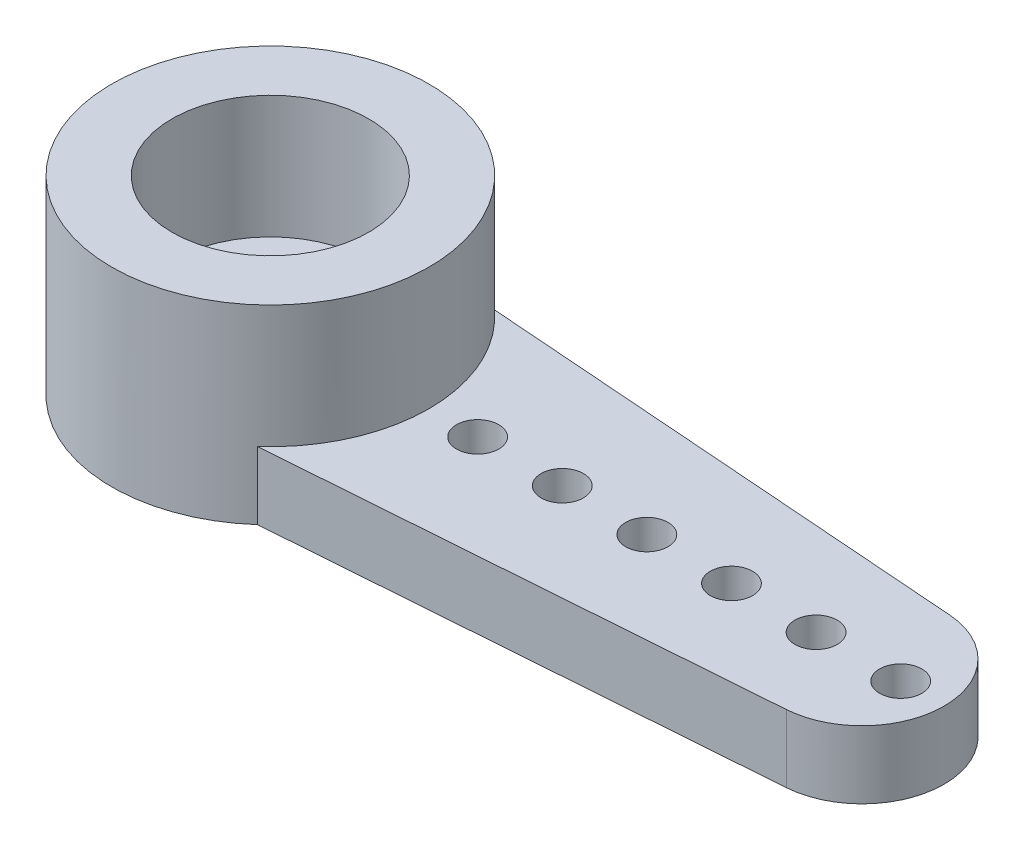
ISO-10303-21;
HEADER;
FILE_DESCRIPTION(('STEP AP214'),'2;1');
FILE_NAME('part.step','',(''),(''),'','','');
FILE_SCHEMA(('AUTOMOTIVE_DESIGN { 1 0 10303 214 1 1 1 1 }'));
ENDSEC;
DATA;
#1=APPLICATION_CONTEXT('core data for automotive mechanical design processes');
#2=APPLICATION_PROTOCOL_DEFINITION('international standard','automotive_design',2000,#1);
#3=PRODUCT_CONTEXT('',#1,'mechanical');
#4=PRODUCT('Part','Part','',(#3));
#5=PRODUCT_RELATED_PRODUCT_CATEGORY('part','',(#4));
#6=PRODUCT_DEFINITION_FORMATION('','',#4);
#7=PRODUCT_DEFINITION_CONTEXT('part definition',#1,'design');
#8=PRODUCT_DEFINITION('design','',#6,#7);
#9=PRODUCT_DEFINITION_SHAPE('','',#8);
#10=(LENGTH_UNIT() NAMED_UNIT(*) SI_UNIT(.MILLI.,.METRE.));
#11=(NAMED_UNIT(*) PLANE_ANGLE_UNIT() SI_UNIT($,.RADIAN.));
#12=(NAMED_UNIT(*) SI_UNIT($,.STERADIAN.) SOLID_ANGLE_UNIT());
#13=UNCERTAINTY_MEASURE_WITH_UNIT(LENGTH_MEASURE(1.E-05),#10,'distance_accuracy_value','');
#14=(GEOMETRIC_REPRESENTATION_CONTEXT(3) GLOBAL_UNCERTAINTY_ASSIGNED_CONTEXT((#13)) GLOBAL_UNIT_ASSIGNED_CONTEXT((#10,
#11,#12)) REPRESENTATION_CONTEXT('',''));
#15=CARTESIAN_POINT('',(0.,0.,0.));
#16=DIRECTION('',(0.,0.,1.));
#17=DIRECTION('',(1.,0.,0.));
#18=AXIS2_PLACEMENT_3D('',#15,#16,#17);
#19=CARTESIAN_POINT('',(0.,1.6,0.));
#20=DIRECTION('',(0.,-1.,0.));
#21=DIRECTION('',(0.,0.,-1.));
#22=AXIS2_PLACEMENT_3D('',#19,#20,#21);
#23=CYLINDRICAL_SURFACE('',#22,1.5);
#24=CARTESIAN_POINT('',(0.,1.6,0.));
#25=DIRECTION('',(0.,1.,0.));
#26=DIRECTION('',(0.,0.,1.));
#27=AXIS2_PLACEMENT_3D('',#24,#25,#26);
#28=CIRCLE('',#27,1.5);
#29=CARTESIAN_POINT('',(0.,1.6,1.5));
#30=VERTEX_POINT('',#29);
#31=EDGE_CURVE('E108',#30,#30,#28,.T.);
#32=ORIENTED_EDGE('',*,*,#31,.T.);
#33=EDGE_LOOP('',(#32));
#34=FACE_BOUND('',#33,.T.);
#35=CARTESIAN_POINT('',(0.,0.8,0.));
#36=DIRECTION('',(0.,-1.,0.));
#37=DIRECTION('',(0.,0.,-1.));
#38=AXIS2_PLACEMENT_3D('',#35,#36,#37);
#39=CIRCLE('',#38,1.5);
#40=CARTESIAN_POINT('',(0.,0.8,-1.5));
#41=VERTEX_POINT('',#40);
#42=EDGE_CURVE('E40',#41,#41,#39,.T.);
#43=ORIENTED_EDGE('',*,*,#42,.T.);
#44=EDGE_LOOP('',(#43));
#45=FACE_BOUND('',#44,.T.);
#46=ADVANCED_FACE('F33',(#34,#45),#23,.F.);
#47=CARTESIAN_POINT('',(14.1314068018781,1.76,-1.93230912585367));
#48=CARTESIAN_POINT('',(14.1314068018781,1.70666666666667,-1.93230912585367));
#49=CARTESIAN_POINT('',(14.1314068018781,1.65333333333333,-1.93230912585367));
#50=CARTESIAN_POINT('',(14.1314068018781,1.06666666666671,-1.93230912585367));
#51=CARTESIAN_POINT('',(14.1314068018781,0.53333333333331,-1.93230912585367));
#52=CARTESIAN_POINT('',(14.1314068018781,-0.0533333333333311,-1.93230912585367));
#53=CARTESIAN_POINT('',(14.1314068018781,-0.106666666666667,-1.93230912585367));
#54=CARTESIAN_POINT('',(14.1314068018781,-0.16,-1.93230912585367));
#55=CARTESIAN_POINT('',(17.4863916285294,1.76,-1.68214916068935));
#56=CARTESIAN_POINT('',(17.4863916285294,1.70666666666667,-1.68214916068935));
#57=CARTESIAN_POINT('',(17.4863916285294,1.65333333333332,-1.68214916068935));
#58=CARTESIAN_POINT('',(17.4863916285294,1.06666666666677,-1.68214916068935));
#59=CARTESIAN_POINT('',(17.4863916285294,0.53333333333331,-1.68214916068935));
#60=CARTESIAN_POINT('',(17.4863916285294,-0.0533333333333311,-1.68214916068935));
#61=CARTESIAN_POINT('',(17.4863916285294,-0.106666666666667,-1.68214916068935));
#62=CARTESIAN_POINT('',(17.4863916285294,-0.16,-1.68214916068935));
#63=CARTESIAN_POINT('',(17.4863916285294,1.76,1.68214916068935));
#64=CARTESIAN_POINT('',(17.4863916285294,1.7066666666667,1.68214916068935));
#65=CARTESIAN_POINT('',(17.4863916285294,1.65333333333329,1.68214916068935));
#66=CARTESIAN_POINT('',(17.4863916285294,1.06666666666706,1.68214916068935));
#67=CARTESIAN_POINT('',(17.4863916285294,0.53333333333331,1.68214916068935));
#68=CARTESIAN_POINT('',(17.4863916285294,-0.0533333333333311,1.68214916068935));
#69=CARTESIAN_POINT('',(17.4863916285294,-0.106666666666667,1.68214916068935));
#70=CARTESIAN_POINT('',(17.4863916285294,-0.16,1.68214916068935));
#71=CARTESIAN_POINT('',(14.1314068018781,1.76,1.93230912585367));
#72=CARTESIAN_POINT('',(14.1314068018781,1.7066666666667,1.93230912585367));
#73=CARTESIAN_POINT('',(14.1314068018781,1.65333333333329,1.93230912585367));
#74=CARTESIAN_POINT('',(14.1314068018781,1.06666666666712,1.93230912585367));
#75=CARTESIAN_POINT('',(14.1314068018781,0.53333333333331,1.93230912585367));
#76=CARTESIAN_POINT('',(14.1314068018781,-0.0533333333333311,1.93230912585367));
#77=CARTESIAN_POINT('',(14.1314068018781,-0.106666666666667,1.93230912585367));
#78=CARTESIAN_POINT('',(14.1314068018781,-0.16,1.93230912585367));
#79=(BOUNDED_SURFACE() B_SPLINE_SURFACE(3,3,((#47,#48,#49,#50,#51,#52,#53,#54),(#55,#56,#57,#58,
#59,#60,#61,#62),(#63,#64,#65,#66,#67,#68,#69,#70),(#71,#72,#73,#74,#75,#76,#77,#78)),
.UNSPECIFIED.,.F.,.F.,.F.) B_SPLINE_SURFACE_WITH_KNOTS((4,4),(4,2,2,4),(0.,1.),(-0.1,0.,1.,1.1),
.UNSPECIFIED.) GEOMETRIC_REPRESENTATION_ITEM() RATIONAL_B_SPLINE_SURFACE(((1.,1.,1.,1.,1.,1.,1.,
1.),(0.382904832106128,0.382904832106128,0.382904832106128,0.382904832106128,0.382904832106128,
0.382904832106128,0.382904832106128,0.382904832106128),(0.382904832106128,0.382904832106128,
0.382904832106128,0.382904832106128,0.382904832106128,0.382904832106128,0.382904832106128,
0.382904832106128),(1.,1.,1.,1.,1.,1.,1.,1.))) REPRESENTATION_ITEM('') SURFACE());
#80=CARTESIAN_POINT('',(14.1314068018781,-0.16,-1.93230912585367));
#81=CARTESIAN_POINT('',(14.1314068018781,-0.106666666666667,-1.93230912585367));
#82=CARTESIAN_POINT('',(14.1314068018781,-0.0533333333333311,-1.93230912585367));
#83=CARTESIAN_POINT('',(14.1314068018781,0.53333333333331,-1.93230912585367));
#84=CARTESIAN_POINT('',(14.1314068018781,1.06666666666671,-1.93230912585367));
#85=CARTESIAN_POINT('',(14.1314068018781,1.65333333333333,-1.93230912585367));
#86=CARTESIAN_POINT('',(14.1314068018781,1.70666666666667,-1.93230912585367));
#87=CARTESIAN_POINT('',(14.1314068018781,1.76,-1.93230912585367));
#88=(BOUNDED_CURVE() B_SPLINE_CURVE(3,(#80,#81,#82,#83,#84,#85,#86,#87),.UNSPECIFIED.,.F.,
.F.) B_SPLINE_CURVE_WITH_KNOTS((4,2,2,4),(-0.1,0.,1.,1.1),
.UNSPECIFIED.) CURVE() GEOMETRIC_REPRESENTATION_ITEM() RATIONAL_B_SPLINE_CURVE((1.,1.,1.,1.,1.,
1.,1.,1.)) REPRESENTATION_ITEM(''));
#89=CARTESIAN_POINT('',(14.1314068018781,1.6,-1.93230912585367));
#90=VERTEX_POINT('',#89);
#91=CARTESIAN_POINT('',(14.1314068018781,0.,-1.93230912585367));
#92=VERTEX_POINT('',#91);
#93=EDGE_CURVE('E97',#90,#92,#88,.F.);
#94=CARTESIAN_POINT('',(14.1314068018781,1.6,-1.93230912585367));
#95=CARTESIAN_POINT('',(17.4863916285294,1.6,-1.68214916068935));
#96=CARTESIAN_POINT('',(17.4863916285294,1.6,1.68214916068935));
#97=CARTESIAN_POINT('',(14.1314068018781,1.6,1.93230912585367));
#98=(BOUNDED_CURVE() B_SPLINE_CURVE(3,(#94,#95,#96,#97),.UNSPECIFIED.,.F.,
.F.) B_SPLINE_CURVE_WITH_KNOTS((4,4),(0.,1.),
.UNSPECIFIED.) CURVE() GEOMETRIC_REPRESENTATION_ITEM() RATIONAL_B_SPLINE_CURVE((1.,
0.382904832106128,0.382904832106128,1.)) REPRESENTATION_ITEM(''));
#99=CARTESIAN_POINT('',(14.1314068018781,1.6,1.93230912585367));
#100=VERTEX_POINT('',#99);
#101=EDGE_CURVE('E45',#100,#90,#98,.F.);
#102=CARTESIAN_POINT('',(14.1314068018781,1.76,1.93230912585367));
#103=CARTESIAN_POINT('',(14.1314068018781,1.7066666666667,1.93230912585367));
#104=CARTESIAN_POINT('',(14.1314068018781,1.65333333333329,1.93230912585367));
#105=CARTESIAN_POINT('',(14.1314068018781,1.06666666666712,1.93230912585367));
#106=CARTESIAN_POINT('',(14.1314068018781,0.53333333333331,1.93230912585367));
#107=CARTESIAN_POINT('',(14.1314068018781,-0.0533333333333311,1.93230912585367));
#108=CARTESIAN_POINT('',(14.1314068018781,-0.106666666666667,1.93230912585367));
#109=CARTESIAN_POINT('',(14.1314068018781,-0.16,1.93230912585367));
#110=(BOUNDED_CURVE() B_SPLINE_CURVE(3,(#102,#103,#104,#105,#106,#107,#108,#109),.UNSPECIFIED.,
.F.,.F.) B_SPLINE_CURVE_WITH_KNOTS((4,2,2,4),(-0.1,0.,1.,1.1),
.UNSPECIFIED.) CURVE() GEOMETRIC_REPRESENTATION_ITEM() RATIONAL_B_SPLINE_CURVE((1.,1.,1.,1.,1.,
1.,1.,1.)) REPRESENTATION_ITEM(''));
#111=CARTESIAN_POINT('',(14.1314068018781,0.,1.93230912585367));
#112=VERTEX_POINT('',#111);
#113=EDGE_CURVE('E83',#112,#100,#110,.F.);
#114=CARTESIAN_POINT('',(14.1314068018781,0.,1.93230912585367));
#115=CARTESIAN_POINT('',(17.4863916285294,0.,1.68214916068935));
#116=CARTESIAN_POINT('',(17.4863916285294,0.,-1.68214916068935));
#117=CARTESIAN_POINT('',(14.1314068018781,0.,-1.93230912585367));
#118=(BOUNDED_CURVE() B_SPLINE_CURVE(3,(#114,#115,#116,#117),.UNSPECIFIED.,.F.,
.F.) B_SPLINE_CURVE_WITH_KNOTS((4,4),(0.,1.),
.UNSPECIFIED.) CURVE() GEOMETRIC_REPRESENTATION_ITEM() RATIONAL_B_SPLINE_CURVE((1.,
0.382904832106128,0.382904832106128,1.)) REPRESENTATION_ITEM(''));
#119=EDGE_CURVE('E11',#92,#112,#118,.F.);
#120=ORIENTED_EDGE('',*,*,#93,.F.);
#121=ORIENTED_EDGE('',*,*,#101,.F.);
#122=ORIENTED_EDGE('',*,*,#113,.F.);
#123=ORIENTED_EDGE('',*,*,#119,.F.);
#124=EDGE_LOOP('',(#120,#121,#122,#123));
#125=FACE_BOUND('',#124,.T.);
#126=ADVANCED_FACE('F35',(#125),#79,.T.);
#127=CARTESIAN_POINT('',(0.,1.6,0.));
#128=DIRECTION('',(0.,1.,0.));
#129=DIRECTION('',(0.,0.,1.));
#130=AXIS2_PLACEMENT_3D('',#127,#128,#129);
#131=PLANE('',#130);
#132=DIRECTION('',(0.997231667992043,0.,-0.0743572481591926));
#133=VECTOR('',#132,1.);
#134=CARTESIAN_POINT('',(2.49449393665328,1.6,2.8));
#135=LINE('',#134,#133);
#136=CARTESIAN_POINT('',(2.49449393665328,1.6,2.8));
#137=VERTEX_POINT('',#136);
#138=EDGE_CURVE('E78',#137,#100,#135,.T.);
#139=ORIENTED_EDGE('',*,*,#138,.T.);
#140=ORIENTED_EDGE('',*,*,#101,.T.);
#141=DIRECTION('',(-0.997231667992043,0.,-0.0743572481591926));
#142=VECTOR('',#141,1.);
#143=CARTESIAN_POINT('',(2.49449393665328,1.6,-2.8));
#144=LINE('',#143,#142);
#145=CARTESIAN_POINT('',(2.49449393665328,1.6,-2.8));
#146=VERTEX_POINT('',#145);
#147=EDGE_CURVE('E87',#90,#146,#144,.T.);
#148=ORIENTED_EDGE('',*,*,#147,.T.);
#149=CARTESIAN_POINT('',(0.,1.6,0.));
#150=DIRECTION('',(0.,1.,0.));
#151=DIRECTION('',(0.,0.,1.));
#152=AXIS2_PLACEMENT_3D('',#149,#150,#151);
#153=CIRCLE('',#152,3.75);
#154=EDGE_CURVE('E95',#137,#146,#153,.T.);
#155=ORIENTED_EDGE('',*,*,#154,.F.);
#156=EDGE_LOOP('',(#139,#140,#148,#155));
#157=FACE_BOUND('',#156,.T.);
#158=CARTESIAN_POINT('',(12.9,1.6,0.));
#159=DIRECTION('',(0.,1.,0.));
#160=DIRECTION('',(0.,0.,1.));
#161=AXIS2_PLACEMENT_3D('',#158,#159,#160);
#162=CIRCLE('',#161,0.500000000000001);
#163=CARTESIAN_POINT('',(12.9,1.6,0.500000000000001));
#164=VERTEX_POINT('',#163);
#165=EDGE_CURVE('E255',#164,#164,#162,.T.);
#166=ORIENTED_EDGE('',*,*,#165,.F.);
#167=EDGE_LOOP('',(#166));
#168=FACE_BOUND('',#167,.T.);
#169=CARTESIAN_POINT('',(8.9,1.6,0.));
#170=DIRECTION('',(0.,1.,0.));
#171=DIRECTION('',(0.,0.,1.));
#172=AXIS2_PLACEMENT_3D('',#169,#170,#171);
#173=CIRCLE('',#172,0.500000000000001);
#174=CARTESIAN_POINT('',(8.9,1.6,0.500000000000001));
#175=VERTEX_POINT('',#174);
#176=EDGE_CURVE('E267',#175,#175,#173,.T.);
#177=ORIENTED_EDGE('',*,*,#176,.F.);
#178=EDGE_LOOP('',(#177));
#179=FACE_BOUND('',#178,.T.);
#180=CARTESIAN_POINT('',(4.9,1.6,0.));
#181=DIRECTION('',(0.,1.,0.));
#182=DIRECTION('',(0.,0.,1.));
#183=AXIS2_PLACEMENT_3D('',#180,#181,#182);
#184=CIRCLE('',#183,0.500000000000001);
#185=CARTESIAN_POINT('',(4.9,1.6,0.500000000000001));
#186=VERTEX_POINT('',#185);
#187=EDGE_CURVE('E279',#186,#186,#184,.T.);
#188=ORIENTED_EDGE('',*,*,#187,.F.);
#189=EDGE_LOOP('',(#188));
#190=FACE_BOUND('',#189,.T.);
#191=CARTESIAN_POINT('',(6.9,1.6,0.));
#192=DIRECTION('',(0.,1.,0.));
#193=DIRECTION('',(0.,0.,1.));
#194=AXIS2_PLACEMENT_3D('',#191,#192,#193);
#195=CIRCLE('',#194,0.500000000000001);
#196=CARTESIAN_POINT('',(6.9,1.6,0.500000000000001));
#197=VERTEX_POINT('',#196);
#198=EDGE_CURVE('E273',#197,#197,#195,.T.);
#199=ORIENTED_EDGE('',*,*,#198,.F.);
#200=EDGE_LOOP('',(#199));
#201=FACE_BOUND('',#200,.T.);
#202=CARTESIAN_POINT('',(10.9,1.6,0.));
#203=DIRECTION('',(0.,1.,0.));
#204=DIRECTION('',(0.,0.,1.));
#205=AXIS2_PLACEMENT_3D('',#202,#203,#204);
#206=CIRCLE('',#205,0.500000000000001);
#207=CARTESIAN_POINT('',(10.9,1.6,0.500000000000001));
#208=VERTEX_POINT('',#207);
#209=EDGE_CURVE('E261',#208,#208,#206,.T.);
#210=ORIENTED_EDGE('',*,*,#209,.F.);
#211=EDGE_LOOP('',(#210));
#212=FACE_BOUND('',#211,.T.);
#213=CARTESIAN_POINT('',(14.9,1.6,0.));
#214=DIRECTION('',(0.,1.,0.));
#215=DIRECTION('',(0.,0.,1.));
#216=AXIS2_PLACEMENT_3D('',#213,#214,#215);
#217=CIRCLE('',#216,0.500000000000001);
#218=CARTESIAN_POINT('',(14.9,1.6,0.500000000000001));
#219=VERTEX_POINT('',#218);
#220=EDGE_CURVE('E248',#219,#219,#217,.T.);
#221=ORIENTED_EDGE('',*,*,#220,.F.);
#222=EDGE_LOOP('',(#221));
#223=FACE_BOUND('',#222,.T.);
#224=ADVANCED_FACE('F100',(#157,#168,#179,#190,#201,#212,#223),#131,.T.);
#225=ORIENTED_EDGE('',*,*,#31,.F.);
#226=EDGE_LOOP('',(#225));
#227=FACE_BOUND('',#226,.T.);
#228=CARTESIAN_POINT('',(0.,1.6,0.));
#229=DIRECTION('',(0.,1.,0.));
#230=DIRECTION('',(0.,0.,1.));
#231=AXIS2_PLACEMENT_3D('',#228,#229,#230);
#232=CIRCLE('',#231,2.325);
#233=CARTESIAN_POINT('',(0.,1.6,2.325));
#234=VERTEX_POINT('',#233);
#235=EDGE_CURVE('E111',#234,#234,#232,.T.);
#236=ORIENTED_EDGE('',*,*,#235,.T.);
#237=EDGE_LOOP('',(#236));
#238=FACE_BOUND('',#237,.T.);
#239=ADVANCED_FACE('F178',(#227,#238),#131,.T.);
#240=CARTESIAN_POINT('',(0.,0.,0.));
#241=DIRECTION('',(0.,1.,0.));
#242=DIRECTION('',(0.,0.,1.));
#243=AXIS2_PLACEMENT_3D('',#240,#241,#242);
#244=PLANE('',#243);
#245=CARTESIAN_POINT('',(0.,0.,0.));
#246=DIRECTION('',(0.,-1.,0.));
#247=DIRECTION('',(0.,0.,-1.));
#248=AXIS2_PLACEMENT_3D('',#245,#246,#247);
#249=CIRCLE('',#248,2.45);
#250=CARTESIAN_POINT('',(0.,0.,-2.45));
#251=VERTEX_POINT('',#250);
#252=EDGE_CURVE('E229',#251,#251,#249,.T.);
#253=ORIENTED_EDGE('',*,*,#252,.F.);
#254=EDGE_LOOP('',(#253));
#255=FACE_BOUND('',#254,.T.);
#256=CARTESIAN_POINT('',(14.9,0.,0.));
#257=DIRECTION('',(0.,1.,0.));
#258=DIRECTION('',(0.,0.,1.));
#259=AXIS2_PLACEMENT_3D('',#256,#257,#258);
#260=CIRCLE('',#259,0.500000000000001);
#261=CARTESIAN_POINT('',(14.9,0.,0.500000000000001));
#262=VERTEX_POINT('',#261);
#263=EDGE_CURVE('E246',#262,#262,#260,.T.);
#264=ORIENTED_EDGE('',*,*,#263,.T.);
#265=EDGE_LOOP('',(#264));
#266=FACE_BOUND('',#265,.T.);
#267=CARTESIAN_POINT('',(10.9,0.,0.));
#268=DIRECTION('',(0.,1.,0.));
#269=DIRECTION('',(0.,0.,1.));
#270=AXIS2_PLACEMENT_3D('',#267,#268,#269);
#271=CIRCLE('',#270,0.500000000000001);
#272=CARTESIAN_POINT('',(10.9,0.,0.500000000000001));
#273=VERTEX_POINT('',#272);
#274=EDGE_CURVE('E258',#273,#273,#271,.T.);
#275=ORIENTED_EDGE('',*,*,#274,.T.);
#276=EDGE_LOOP('',(#275));
#277=FACE_BOUND('',#276,.T.);
#278=CARTESIAN_POINT('',(6.9,0.,0.));
#279=DIRECTION('',(0.,1.,0.));
#280=DIRECTION('',(0.,0.,1.));
#281=AXIS2_PLACEMENT_3D('',#278,#279,#280);
#282=CIRCLE('',#281,0.500000000000001);
#283=CARTESIAN_POINT('',(6.9,0.,0.500000000000001));
#284=VERTEX_POINT('',#283);
#285=EDGE_CURVE('E270',#284,#284,#282,.T.);
#286=ORIENTED_EDGE('',*,*,#285,.T.);
#287=EDGE_LOOP('',(#286));
#288=FACE_BOUND('',#287,.T.);
#289=CARTESIAN_POINT('',(0.,0.,0.));
#290=DIRECTION('',(0.,1.,0.));
#291=DIRECTION('',(0.,0.,1.));
#292=AXIS2_PLACEMENT_3D('',#289,#290,#291);
#293=CIRCLE('',#292,3.75);
#294=CARTESIAN_POINT('',(2.49449393665328,0.,-2.8));
#295=VERTEX_POINT('',#294);
#296=CARTESIAN_POINT('',(2.49449393665328,0.,2.8));
#297=VERTEX_POINT('',#296);
#298=EDGE_CURVE('E96',#295,#297,#293,.T.);
#299=ORIENTED_EDGE('',*,*,#298,.F.);
#300=DIRECTION('',(-0.997231667992043,0.,-0.0743572481591926));
#301=VECTOR('',#300,1.);
#302=CARTESIAN_POINT('',(2.49449393665328,0.,-2.8));
#303=LINE('',#302,#301);
#304=EDGE_CURVE('E88',#92,#295,#303,.T.);
#305=ORIENTED_EDGE('',*,*,#304,.F.);
#306=ORIENTED_EDGE('',*,*,#119,.T.);
#307=DIRECTION('',(0.997231667992043,0.,-0.0743572481591926));
#308=VECTOR('',#307,1.);
#309=CARTESIAN_POINT('',(2.49449393665328,0.,2.8));
#310=LINE('',#309,#308);
#311=EDGE_CURVE('E140',#297,#112,#310,.T.);
#312=ORIENTED_EDGE('',*,*,#311,.F.);
#313=EDGE_LOOP('',(#299,#305,#306,#312));
#314=FACE_BOUND('',#313,.T.);
#315=CARTESIAN_POINT('',(4.9,0.,0.));
#316=DIRECTION('',(0.,1.,0.));
#317=DIRECTION('',(0.,0.,1.));
#318=AXIS2_PLACEMENT_3D('',#315,#316,#317);
#319=CIRCLE('',#318,0.500000000000001);
#320=CARTESIAN_POINT('',(4.9,0.,0.500000000000001));
#321=VERTEX_POINT('',#320);
#322=EDGE_CURVE('E276',#321,#321,#319,.T.);
#323=ORIENTED_EDGE('',*,*,#322,.T.);
#324=EDGE_LOOP('',(#323));
#325=FACE_BOUND('',#324,.T.);
#326=CARTESIAN_POINT('',(8.9,0.,0.));
#327=DIRECTION('',(0.,1.,0.));
#328=DIRECTION('',(0.,0.,1.));
#329=AXIS2_PLACEMENT_3D('',#326,#327,#328);
#330=CIRCLE('',#329,0.500000000000001);
#331=CARTESIAN_POINT('',(8.9,0.,0.500000000000001));
#332=VERTEX_POINT('',#331);
#333=EDGE_CURVE('E264',#332,#332,#330,.T.);
#334=ORIENTED_EDGE('',*,*,#333,.T.);
#335=EDGE_LOOP('',(#334));
#336=FACE_BOUND('',#335,.T.);
#337=CARTESIAN_POINT('',(12.9,0.,0.));
#338=DIRECTION('',(0.,1.,0.));
#339=DIRECTION('',(0.,0.,1.));
#340=AXIS2_PLACEMENT_3D('',#337,#338,#339);
#341=CIRCLE('',#340,0.500000000000001);
#342=CARTESIAN_POINT('',(12.9,0.,0.500000000000001));
#343=VERTEX_POINT('',#342);
#344=EDGE_CURVE('E253',#343,#343,#341,.T.);
#345=ORIENTED_EDGE('',*,*,#344,.T.);
#346=EDGE_LOOP('',(#345));
#347=FACE_BOUND('',#346,.T.);
#348=ADVANCED_FACE('F152',(#255,#266,#277,#288,#314,#325,#336,#347),#244,.F.);
#349=CARTESIAN_POINT('',(0.,1.6,0.));
#350=DIRECTION('',(0.,-1.,0.));
#351=DIRECTION('',(0.,0.,-1.));
#352=AXIS2_PLACEMENT_3D('',#349,#350,#351);
#353=CYLINDRICAL_SURFACE('',#352,3.75);
#354=DIRECTION('',(0.,-1.,0.));
#355=VECTOR('',#354,1.);
#356=CARTESIAN_POINT('',(2.49449393665328,1.6,-2.8));
#357=LINE('',#356,#355);
#358=EDGE_CURVE('E98',#146,#295,#357,.T.);
#359=ORIENTED_EDGE('',*,*,#358,.T.);
#360=ORIENTED_EDGE('',*,*,#298,.T.);
#361=DIRECTION('',(0.,-1.,0.));
#362=VECTOR('',#361,1.);
#363=CARTESIAN_POINT('',(2.49449393665328,1.6,2.8));
#364=LINE('',#363,#362);
#365=EDGE_CURVE('E82',#137,#297,#364,.T.);
#366=ORIENTED_EDGE('',*,*,#365,.F.);
#367=ORIENTED_EDGE('',*,*,#154,.T.);
#368=EDGE_LOOP('',(#359,#360,#366,#367));
#369=FACE_BOUND('',#368,.T.);
#370=CARTESIAN_POINT('',(0.,4.5,0.));
#371=DIRECTION('',(0.,1.,0.));
#372=DIRECTION('',(0.,0.,1.));
#373=AXIS2_PLACEMENT_3D('',#370,#371,#372);
#374=CIRCLE('',#373,3.75);
#375=CARTESIAN_POINT('',(0.,4.5,3.75));
#376=VERTEX_POINT('',#375);
#377=EDGE_CURVE('E104',#376,#376,#374,.T.);
#378=ORIENTED_EDGE('',*,*,#377,.F.);
#379=EDGE_LOOP('',(#378));
#380=FACE_BOUND('',#379,.T.);
#381=ADVANCED_FACE('F93',(#369,#380),#353,.T.);
#382=CARTESIAN_POINT('',(2.49449393665328,1.6,2.8));
#383=DIRECTION('',(-0.0743572481591926,0.,-0.997231667992043));
#384=DIRECTION('',(-0.997231667992043,0.,0.0743572481591926));
#385=AXIS2_PLACEMENT_3D('',#382,#383,#384);
#386=PLANE('',#385);
#387=ORIENTED_EDGE('',*,*,#311,.T.);
#388=ORIENTED_EDGE('',*,*,#113,.T.);
#389=ORIENTED_EDGE('',*,*,#138,.F.);
#390=ORIENTED_EDGE('',*,*,#365,.T.);
#391=EDGE_LOOP('',(#387,#388,#389,#390));
#392=FACE_BOUND('',#391,.T.);
#393=ADVANCED_FACE('F81',(#392),#386,.F.);
#394=CARTESIAN_POINT('',(2.49449393665328,1.6,-2.8));
#395=DIRECTION('',(-0.0743572481591926,0.,0.997231667992043));
#396=DIRECTION('',(0.997231667992043,0.,0.0743572481591926));
#397=AXIS2_PLACEMENT_3D('',#394,#395,#396);
#398=PLANE('',#397);
#399=ORIENTED_EDGE('',*,*,#147,.F.);
#400=ORIENTED_EDGE('',*,*,#93,.T.);
#401=ORIENTED_EDGE('',*,*,#304,.T.);
#402=ORIENTED_EDGE('',*,*,#358,.F.);
#403=EDGE_LOOP('',(#399,#400,#401,#402));
#404=FACE_BOUND('',#403,.T.);
#405=ADVANCED_FACE('F141',(#404),#398,.F.);
#406=CARTESIAN_POINT('',(4.9,1.6,0.));
#407=DIRECTION('',(0.,-1.,0.));
#408=DIRECTION('',(0.,0.,-1.));
#409=AXIS2_PLACEMENT_3D('',#406,#407,#408);
#410=CYLINDRICAL_SURFACE('',#409,0.500000000000001);
#411=ORIENTED_EDGE('',*,*,#187,.T.);
#412=EDGE_LOOP('',(#411));
#413=FACE_BOUND('',#412,.T.);
#414=ORIENTED_EDGE('',*,*,#322,.F.);
#415=EDGE_LOOP('',(#414));
#416=FACE_BOUND('',#415,.T.);
#417=ADVANCED_FACE('F151',(#413,#416),#410,.F.);
#418=CARTESIAN_POINT('',(6.9,1.6,0.));
#419=DIRECTION('',(0.,-1.,0.));
#420=DIRECTION('',(0.,0.,-1.));
#421=AXIS2_PLACEMENT_3D('',#418,#419,#420);
#422=CYLINDRICAL_SURFACE('',#421,0.500000000000001);
#423=ORIENTED_EDGE('',*,*,#198,.T.);
#424=EDGE_LOOP('',(#423));
#425=FACE_BOUND('',#424,.T.);
#426=ORIENTED_EDGE('',*,*,#285,.F.);
#427=EDGE_LOOP('',(#426));
#428=FACE_BOUND('',#427,.T.);
#429=ADVANCED_FACE('F181',(#425,#428),#422,.F.);
#430=CARTESIAN_POINT('',(8.9,1.6,0.));
#431=DIRECTION('',(0.,-1.,0.));
#432=DIRECTION('',(0.,0.,-1.));
#433=AXIS2_PLACEMENT_3D('',#430,#431,#432);
#434=CYLINDRICAL_SURFACE('',#433,0.500000000000001);
#435=ORIENTED_EDGE('',*,*,#176,.T.);
#436=EDGE_LOOP('',(#435));
#437=FACE_BOUND('',#436,.T.);
#438=ORIENTED_EDGE('',*,*,#333,.F.);
#439=EDGE_LOOP('',(#438));
#440=FACE_BOUND('',#439,.T.);
#441=ADVANCED_FACE('F185',(#437,#440),#434,.F.);
#442=CARTESIAN_POINT('',(10.9,1.6,0.));
#443=DIRECTION('',(0.,-1.,0.));
#444=DIRECTION('',(0.,0.,-1.));
#445=AXIS2_PLACEMENT_3D('',#442,#443,#444);
#446=CYLINDRICAL_SURFACE('',#445,0.500000000000001);
#447=ORIENTED_EDGE('',*,*,#209,.T.);
#448=EDGE_LOOP('',(#447));
#449=FACE_BOUND('',#448,.T.);
#450=ORIENTED_EDGE('',*,*,#274,.F.);
#451=EDGE_LOOP('',(#450));
#452=FACE_BOUND('',#451,.T.);
#453=ADVANCED_FACE('F189',(#449,#452),#446,.F.);
#454=CARTESIAN_POINT('',(12.9,1.6,0.));
#455=DIRECTION('',(0.,-1.,0.));
#456=DIRECTION('',(0.,0.,-1.));
#457=AXIS2_PLACEMENT_3D('',#454,#455,#456);
#458=CYLINDRICAL_SURFACE('',#457,0.500000000000001);
#459=ORIENTED_EDGE('',*,*,#165,.T.);
#460=EDGE_LOOP('',(#459));
#461=FACE_BOUND('',#460,.T.);
#462=ORIENTED_EDGE('',*,*,#344,.F.);
#463=EDGE_LOOP('',(#462));
#464=FACE_BOUND('',#463,.T.);
#465=ADVANCED_FACE('F193',(#461,#464),#458,.F.);
#466=CARTESIAN_POINT('',(14.9,1.6,0.));
#467=DIRECTION('',(0.,-1.,0.));
#468=DIRECTION('',(0.,0.,-1.));
#469=AXIS2_PLACEMENT_3D('',#466,#467,#468);
#470=CYLINDRICAL_SURFACE('',#469,0.500000000000001);
#471=ORIENTED_EDGE('',*,*,#220,.T.);
#472=EDGE_LOOP('',(#471));
#473=FACE_BOUND('',#472,.T.);
#474=ORIENTED_EDGE('',*,*,#263,.F.);
#475=EDGE_LOOP('',(#474));
#476=FACE_BOUND('',#475,.T.);
#477=ADVANCED_FACE('F197',(#473,#476),#470,.F.);
#478=CARTESIAN_POINT('',(0.,4.5,0.));
#479=DIRECTION('',(0.,1.,0.));
#480=DIRECTION('',(0.,0.,1.));
#481=AXIS2_PLACEMENT_3D('',#478,#479,#480);
#482=PLANE('',#481);
#483=ORIENTED_EDGE('',*,*,#377,.T.);
#484=EDGE_LOOP('',(#483));
#485=FACE_BOUND('',#484,.T.);
#486=CARTESIAN_POINT('',(0.,4.5,0.));
#487=DIRECTION('',(0.,1.,0.));
#488=DIRECTION('',(0.,0.,1.));
#489=AXIS2_PLACEMENT_3D('',#486,#487,#488);
#490=CIRCLE('',#489,2.325);
#491=CARTESIAN_POINT('',(0.,4.5,2.325));
#492=VERTEX_POINT('',#491);
#493=EDGE_CURVE('E105',#492,#492,#490,.T.);
#494=ORIENTED_EDGE('',*,*,#493,.F.);
#495=EDGE_LOOP('',(#494));
#496=FACE_BOUND('',#495,.T.);
#497=ADVANCED_FACE('F201',(#485,#496),#482,.T.);
#498=CARTESIAN_POINT('',(0.,4.5,0.));
#499=DIRECTION('',(0.,-1.,0.));
#500=DIRECTION('',(0.,0.,-1.));
#501=AXIS2_PLACEMENT_3D('',#498,#499,#500);
#502=CYLINDRICAL_SURFACE('',#501,2.325);
#503=ORIENTED_EDGE('',*,*,#493,.T.);
#504=EDGE_LOOP('',(#503));
#505=FACE_BOUND('',#504,.T.);
#506=ORIENTED_EDGE('',*,*,#235,.F.);
#507=EDGE_LOOP('',(#506));
#508=FACE_BOUND('',#507,.T.);
#509=ADVANCED_FACE('F208',(#505,#508),#502,.F.);
#510=CARTESIAN_POINT('',(0.,0.8,0.));
#511=DIRECTION('',(0.,-1.,0.));
#512=DIRECTION('',(0.,0.,-1.));
#513=AXIS2_PLACEMENT_3D('',#510,#511,#512);
#514=CYLINDRICAL_SURFACE('',#513,2.45);
#515=CARTESIAN_POINT('',(0.,0.8,0.));
#516=DIRECTION('',(0.,-1.,0.));
#517=DIRECTION('',(0.,0.,-1.));
#518=AXIS2_PLACEMENT_3D('',#515,#516,#517);
#519=CIRCLE('',#518,2.45);
#520=CARTESIAN_POINT('',(0.,0.8,-2.45));
#521=VERTEX_POINT('',#520);
#522=EDGE_CURVE('E228',#521,#521,#519,.T.);
#523=ORIENTED_EDGE('',*,*,#522,.F.);
#524=EDGE_LOOP('',(#523));
#525=FACE_BOUND('',#524,.T.);
#526=ORIENTED_EDGE('',*,*,#252,.T.);
#527=EDGE_LOOP('',(#526));
#528=FACE_BOUND('',#527,.T.);
#529=ADVANCED_FACE('F212',(#525,#528),#514,.F.);
#530=CARTESIAN_POINT('',(0.,0.8,0.));
#531=DIRECTION('',(0.,-1.,0.));
#532=DIRECTION('',(0.,0.,-1.));
#533=AXIS2_PLACEMENT_3D('',#530,#531,#532);
#534=PLANE('',#533);
#535=ORIENTED_EDGE('',*,*,#42,.F.);
#536=EDGE_LOOP('',(#535));
#537=FACE_BOUND('',#536,.T.);
#538=ORIENTED_EDGE('',*,*,#522,.T.);
#539=EDGE_LOOP('',(#538));
#540=FACE_BOUND('',#539,.T.);
#541=ADVANCED_FACE('F216',(#537,#540),#534,.T.);
#542=CLOSED_SHELL('',(#46,#126,#224,#239,#348,#381,#393,#405,#417,#429,#441,#453,#465,#477,#497,
#509,#529,#541));
#543=MANIFOLD_SOLID_BREP('B2',#542);
#544=ADVANCED_BREP_SHAPE_REPRESENTATION('',(#18,#543),#14);
#545=SHAPE_DEFINITION_REPRESENTATION(#9,#544);
ENDSEC;
END-ISO-10303-21;
